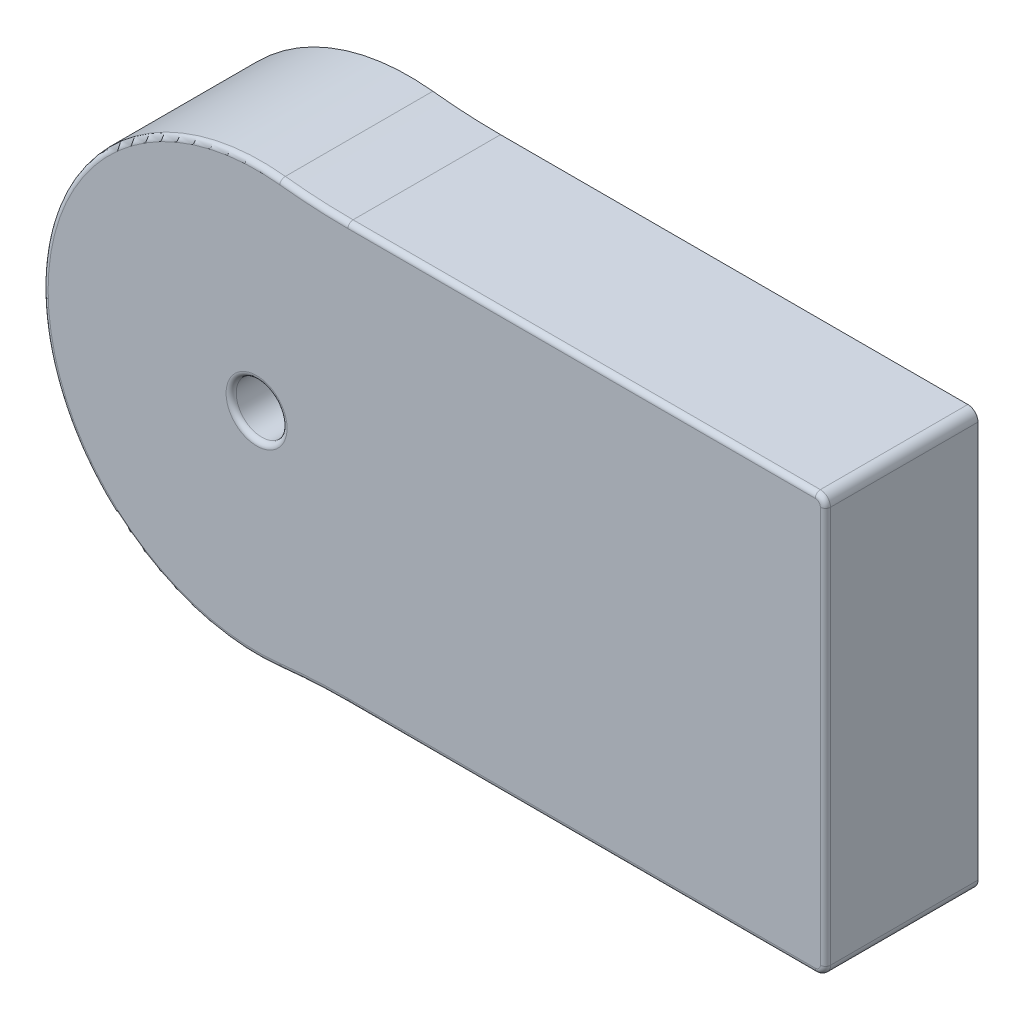
ISO-10303-21;
HEADER;
FILE_DESCRIPTION(('STEP AP214'),'2;1');
FILE_NAME('part.step','',(''),(''),'','','');
FILE_SCHEMA(('AUTOMOTIVE_DESIGN { 1 0 10303 214 1 1 1 1 }'));
ENDSEC;
DATA;
#1=APPLICATION_CONTEXT('core data for automotive mechanical design processes');
#2=APPLICATION_PROTOCOL_DEFINITION('international standard','automotive_design',2000,#1);
#3=PRODUCT_CONTEXT('',#1,'mechanical');
#4=PRODUCT('Part','Part','',(#3));
#5=PRODUCT_RELATED_PRODUCT_CATEGORY('part','',(#4));
#6=PRODUCT_DEFINITION_FORMATION('','',#4);
#7=PRODUCT_DEFINITION_CONTEXT('part definition',#1,'design');
#8=PRODUCT_DEFINITION('design','',#6,#7);
#9=PRODUCT_DEFINITION_SHAPE('','',#8);
#10=(LENGTH_UNIT() NAMED_UNIT(*) SI_UNIT(.MILLI.,.METRE.));
#11=(NAMED_UNIT(*) PLANE_ANGLE_UNIT() SI_UNIT($,.RADIAN.));
#12=(NAMED_UNIT(*) SI_UNIT($,.STERADIAN.) SOLID_ANGLE_UNIT());
#13=UNCERTAINTY_MEASURE_WITH_UNIT(LENGTH_MEASURE(1.E-05),#10,'distance_accuracy_value','');
#14=(GEOMETRIC_REPRESENTATION_CONTEXT(3) GLOBAL_UNCERTAINTY_ASSIGNED_CONTEXT((#13)) GLOBAL_UNIT_ASSIGNED_CONTEXT((#10,
#11,#12)) REPRESENTATION_CONTEXT('',''));
#15=CARTESIAN_POINT('',(0.,0.,0.));
#16=DIRECTION('',(0.,0.,1.));
#17=DIRECTION('',(1.,0.,0.));
#18=AXIS2_PLACEMENT_3D('',#15,#16,#17);
#19=CARTESIAN_POINT('',(0.,0.,30.));
#20=DIRECTION('',(0.,0.,1.));
#21=DIRECTION('',(1.,0.,0.));
#22=AXIS2_PLACEMENT_3D('',#19,#20,#21);
#23=PLANE('',#22);
#24=CARTESIAN_POINT('',(-11.8873596859431,-2.7948066727813,30.));
#25=DIRECTION('',(0.,0.,1.));
#26=DIRECTION('',(1.,0.,0.));
#27=AXIS2_PLACEMENT_3D('',#24,#25,#26);
#28=CIRCLE('',#27,6.);
#29=CARTESIAN_POINT('',(-5.88735968594307,-2.7948066727813,30.));
#30=VERTEX_POINT('',#29);
#31=EDGE_CURVE('E187',#30,#30,#28,.F.);
#32=ORIENTED_EDGE('',*,*,#31,.T.);
#33=EDGE_LOOP('',(#32));
#34=FACE_BOUND('',#33,.T.);
#35=CARTESIAN_POINT('',(97.9845980448078,-41.7948066727813,30.));
#36=DIRECTION('',(0.,0.,1.));
#37=DIRECTION('',(1.,0.,0.));
#38=AXIS2_PLACEMENT_3D('',#35,#36,#37);
#39=CIRCLE('',#38,1.);
#40=CARTESIAN_POINT('',(98.9845980448078,-41.7948066727813,30.));
#41=VERTEX_POINT('',#40);
#42=CARTESIAN_POINT('',(97.9845980448078,-42.7948066727813,30.));
#43=VERTEX_POINT('',#42);
#44=EDGE_CURVE('E229',#41,#43,#39,.F.);
#45=ORIENTED_EDGE('',*,*,#44,.F.);
#46=DIRECTION('',(0.,-1.,0.));
#47=VECTOR('',#46,1.);
#48=CARTESIAN_POINT('',(98.9845980448078,0.,30.));
#49=LINE('',#48,#47);
#50=CARTESIAN_POINT('',(98.9845980448078,36.2051933272187,30.));
#51=VERTEX_POINT('',#50);
#52=EDGE_CURVE('E197',#41,#51,#49,.F.);
#53=ORIENTED_EDGE('',*,*,#52,.T.);
#54=CARTESIAN_POINT('',(97.9845980448078,36.2051933272187,30.));
#55=DIRECTION('',(0.,0.,1.));
#56=DIRECTION('',(1.,0.,0.));
#57=AXIS2_PLACEMENT_3D('',#54,#55,#56);
#58=CIRCLE('',#57,1.);
#59=CARTESIAN_POINT('',(97.9845980448078,37.2051933272187,30.));
#60=VERTEX_POINT('',#59);
#61=EDGE_CURVE('E227',#60,#51,#58,.F.);
#62=ORIENTED_EDGE('',*,*,#61,.F.);
#63=DIRECTION('',(1.,0.,0.));
#64=VECTOR('',#63,1.);
#65=CARTESIAN_POINT('',(0.,37.2051933272187,30.));
#66=LINE('',#65,#64);
#67=CARTESIAN_POINT('',(6.08484106966808,37.2051933272187,30.));
#68=VERTEX_POINT('',#67);
#69=EDGE_CURVE('E200',#60,#68,#66,.F.);
#70=ORIENTED_EDGE('',*,*,#69,.T.);
#71=CARTESIAN_POINT('',(6.08484106966808,158.205193327219,30.));
#72=DIRECTION('',(0.,0.,1.));
#73=DIRECTION('',(1.,0.,0.));
#74=AXIS2_PLACEMENT_3D('',#71,#72,#73);
#75=CIRCLE('',#74,121.);
#76=CARTESIAN_POINT('',(-7.33883974162173,37.9521069074656,30.));
#77=VERTEX_POINT('',#76);
#78=EDGE_CURVE('E202',#68,#77,#75,.F.);
#79=ORIENTED_EDGE('',*,*,#78,.T.);
#80=CARTESIAN_POINT('',(-11.8873596859431,-2.7948066727813,30.));
#81=DIRECTION('',(0.,0.,1.));
#82=DIRECTION('',(1.,0.,0.));
#83=AXIS2_PLACEMENT_3D('',#80,#81,#82);
#84=CIRCLE('',#83,41.);
#85=CARTESIAN_POINT('',(-7.33883974162173,-43.5417202530282,30.));
#86=VERTEX_POINT('',#85);
#87=EDGE_CURVE('E195',#77,#86,#84,.T.);
#88=ORIENTED_EDGE('',*,*,#87,.T.);
#89=CARTESIAN_POINT('',(6.08484106966808,-163.794806672781,30.));
#90=DIRECTION('',(0.,0.,1.));
#91=DIRECTION('',(1.,0.,0.));
#92=AXIS2_PLACEMENT_3D('',#89,#90,#91);
#93=CIRCLE('',#92,121.);
#94=CARTESIAN_POINT('',(6.08484106966808,-42.7948066727813,30.));
#95=VERTEX_POINT('',#94);
#96=EDGE_CURVE('E190',#86,#95,#93,.F.);
#97=ORIENTED_EDGE('',*,*,#96,.T.);
#98=DIRECTION('',(1.,0.,0.));
#99=VECTOR('',#98,1.);
#100=CARTESIAN_POINT('',(99.9845980448078,-42.7948066727813,30.));
#101=LINE('',#100,#99);
#102=EDGE_CURVE('E192',#95,#43,#101,.T.);
#103=ORIENTED_EDGE('',*,*,#102,.T.);
#104=EDGE_LOOP('',(#45,#53,#62,#70,#79,#88,#97,#103));
#105=FACE_BOUND('',#104,.T.);
#106=ADVANCED_FACE('F45',(#34,#105),#23,.T.);
#107=CARTESIAN_POINT('',(-11.8873596859431,-2.7948066727813,30.));
#108=DIRECTION('',(0.,0.,-1.));
#109=DIRECTION('',(-1.,0.,0.));
#110=AXIS2_PLACEMENT_3D('',#107,#108,#109);
#111=CYLINDRICAL_SURFACE('',#110,42.);
#112=DIRECTION('',(0.,0.,-1.));
#113=VECTOR('',#112,1.);
#114=CARTESIAN_POINT('',(-7.22790023078462,-44.535547413522,30.));
#115=LINE('',#114,#113);
#116=CARTESIAN_POINT('',(-7.22790023078462,-44.535547413522,0.));
#117=VERTEX_POINT('',#116);
#118=CARTESIAN_POINT('',(-7.22790023078462,-44.535547413522,29.));
#119=VERTEX_POINT('',#118);
#120=EDGE_CURVE('E151',#117,#119,#115,.F.);
#121=ORIENTED_EDGE('',*,*,#120,.T.);
#122=CARTESIAN_POINT('',(-11.8873596859431,-2.7948066727813,29.));
#123=DIRECTION('',(0.,0.,1.));
#124=DIRECTION('',(1.,0.,0.));
#125=AXIS2_PLACEMENT_3D('',#122,#123,#124);
#126=CIRCLE('',#125,42.);
#127=CARTESIAN_POINT('',(-7.22790023078462,38.9459340679594,29.));
#128=VERTEX_POINT('',#127);
#129=EDGE_CURVE('E146',#119,#128,#126,.F.);
#130=ORIENTED_EDGE('',*,*,#129,.T.);
#131=DIRECTION('',(0.,0.,-1.));
#132=VECTOR('',#131,1.);
#133=CARTESIAN_POINT('',(-7.22790023078462,38.9459340679594,30.));
#134=LINE('',#133,#132);
#135=CARTESIAN_POINT('',(-7.22790023078462,38.9459340679594,0.));
#136=VERTEX_POINT('',#135);
#137=EDGE_CURVE('E138',#128,#136,#134,.T.);
#138=ORIENTED_EDGE('',*,*,#137,.T.);
#139=CARTESIAN_POINT('',(-11.8873596859431,-2.7948066727813,0.));
#140=DIRECTION('',(0.,0.,1.));
#141=DIRECTION('',(1.,0.,0.));
#142=AXIS2_PLACEMENT_3D('',#139,#140,#141);
#143=CIRCLE('',#142,42.);
#144=EDGE_CURVE('E143',#136,#117,#143,.T.);
#145=ORIENTED_EDGE('',*,*,#144,.T.);
#146=EDGE_LOOP('',(#121,#130,#138,#145));
#147=FACE_BOUND('',#146,.T.);
#148=ADVANCED_FACE('F141',(#147),#111,.T.);
#149=CARTESIAN_POINT('',(0.,-43.7948066727813,30.));
#150=DIRECTION('',(0.,1.,0.));
#151=DIRECTION('',(0.,0.,1.));
#152=AXIS2_PLACEMENT_3D('',#149,#150,#151);
#153=PLANE('',#152);
#154=DIRECTION('',(1.,0.,0.));
#155=VECTOR('',#154,1.);
#156=CARTESIAN_POINT('',(0.,-43.7948066727813,0.));
#157=LINE('',#156,#155);
#158=CARTESIAN_POINT('',(6.08484106966808,-43.7948066727813,0.));
#159=VERTEX_POINT('',#158);
#160=CARTESIAN_POINT('',(97.9845980448078,-43.7948066727813,0.));
#161=VERTEX_POINT('',#160);
#162=EDGE_CURVE('E165',#159,#161,#157,.T.);
#163=ORIENTED_EDGE('',*,*,#162,.T.);
#164=DIRECTION('',(0.,0.,-1.));
#165=VECTOR('',#164,1.);
#166=CARTESIAN_POINT('',(97.9845980448078,-43.7948066727813,29.));
#167=LINE('',#166,#165);
#168=CARTESIAN_POINT('',(97.9845980448078,-43.7948066727813,29.));
#169=VERTEX_POINT('',#168);
#170=EDGE_CURVE('E11',#161,#169,#167,.F.);
#171=ORIENTED_EDGE('',*,*,#170,.T.);
#172=DIRECTION('',(1.,0.,0.));
#173=VECTOR('',#172,1.);
#174=CARTESIAN_POINT('',(6.08484106966808,-43.7948066727813,29.));
#175=LINE('',#174,#173);
#176=CARTESIAN_POINT('',(6.08484106966808,-43.7948066727813,29.));
#177=VERTEX_POINT('',#176);
#178=EDGE_CURVE('E213',#169,#177,#175,.F.);
#179=ORIENTED_EDGE('',*,*,#178,.T.);
#180=DIRECTION('',(0.,0.,1.));
#181=VECTOR('',#180,1.);
#182=CARTESIAN_POINT('',(6.08484106966808,-43.7948066727813,0.));
#183=LINE('',#182,#181);
#184=EDGE_CURVE('E160',#177,#159,#183,.F.);
#185=ORIENTED_EDGE('',*,*,#184,.T.);
#186=EDGE_LOOP('',(#163,#171,#179,#185));
#187=FACE_BOUND('',#186,.T.);
#188=ADVANCED_FACE('F308',(#187),#153,.F.);
#189=CARTESIAN_POINT('',(99.9845980448078,0.,30.));
#190=DIRECTION('',(1.,0.,0.));
#191=DIRECTION('',(0.,1.,0.));
#192=AXIS2_PLACEMENT_3D('',#189,#190,#191);
#193=PLANE('',#192);
#194=DIRECTION('',(0.,-1.,0.));
#195=VECTOR('',#194,1.);
#196=CARTESIAN_POINT('',(99.9845980448078,0.,0.));
#197=LINE('',#196,#195);
#198=CARTESIAN_POINT('',(99.9845980448078,36.2051933272187,0.));
#199=VERTEX_POINT('',#198);
#200=CARTESIAN_POINT('',(99.9845980448078,-41.7948066727813,0.));
#201=VERTEX_POINT('',#200);
#202=EDGE_CURVE('E168',#199,#201,#197,.T.);
#203=ORIENTED_EDGE('',*,*,#202,.F.);
#204=DIRECTION('',(0.,0.,-1.));
#205=VECTOR('',#204,1.);
#206=CARTESIAN_POINT('',(99.9845980448078,36.2051933272187,30.));
#207=LINE('',#206,#205);
#208=CARTESIAN_POINT('',(99.9845980448078,36.2051933272187,29.));
#209=VERTEX_POINT('',#208);
#210=EDGE_CURVE('E54',#199,#209,#207,.F.);
#211=ORIENTED_EDGE('',*,*,#210,.T.);
#212=DIRECTION('',(0.,-1.,0.));
#213=VECTOR('',#212,1.);
#214=CARTESIAN_POINT('',(99.9845980448078,0.,29.));
#215=LINE('',#214,#213);
#216=CARTESIAN_POINT('',(99.9845980448078,-41.7948066727813,29.));
#217=VERTEX_POINT('',#216);
#218=EDGE_CURVE('E210',#209,#217,#215,.T.);
#219=ORIENTED_EDGE('',*,*,#218,.T.);
#220=DIRECTION('',(0.,0.,-1.));
#221=VECTOR('',#220,1.);
#222=CARTESIAN_POINT('',(99.9845980448078,-41.7948066727813,0.));
#223=LINE('',#222,#221);
#224=EDGE_CURVE('E70',#217,#201,#223,.T.);
#225=ORIENTED_EDGE('',*,*,#224,.T.);
#226=EDGE_LOOP('',(#203,#211,#219,#225));
#227=FACE_BOUND('',#226,.T.);
#228=ADVANCED_FACE('F262',(#227),#193,.T.);
#229=CARTESIAN_POINT('',(0.,38.2051933272187,30.));
#230=DIRECTION('',(0.,1.,0.));
#231=DIRECTION('',(0.,0.,1.));
#232=AXIS2_PLACEMENT_3D('',#229,#230,#231);
#233=PLANE('',#232);
#234=DIRECTION('',(1.,0.,0.));
#235=VECTOR('',#234,1.);
#236=CARTESIAN_POINT('',(0.,38.2051933272187,29.));
#237=LINE('',#236,#235);
#238=CARTESIAN_POINT('',(6.08484106966808,38.2051933272187,29.));
#239=VERTEX_POINT('',#238);
#240=CARTESIAN_POINT('',(97.9845980448078,38.2051933272187,29.));
#241=VERTEX_POINT('',#240);
#242=EDGE_CURVE('E207',#239,#241,#237,.T.);
#243=ORIENTED_EDGE('',*,*,#242,.T.);
#244=DIRECTION('',(0.,0.,-1.));
#245=VECTOR('',#244,1.);
#246=CARTESIAN_POINT('',(97.9845980448078,38.2051933272187,30.));
#247=LINE('',#246,#245);
#248=CARTESIAN_POINT('',(97.9845980448078,38.2051933272187,0.));
#249=VERTEX_POINT('',#248);
#250=EDGE_CURVE('E238',#241,#249,#247,.T.);
#251=ORIENTED_EDGE('',*,*,#250,.T.);
#252=DIRECTION('',(1.,0.,0.));
#253=VECTOR('',#252,1.);
#254=CARTESIAN_POINT('',(0.,38.2051933272187,0.));
#255=LINE('',#254,#253);
#256=CARTESIAN_POINT('',(6.08484106966808,38.2051933272187,0.));
#257=VERTEX_POINT('',#256);
#258=EDGE_CURVE('E175',#257,#249,#255,.T.);
#259=ORIENTED_EDGE('',*,*,#258,.F.);
#260=DIRECTION('',(0.,0.,-1.));
#261=VECTOR('',#260,1.);
#262=CARTESIAN_POINT('',(6.08484106966808,38.2051933272187,30.));
#263=LINE('',#262,#261);
#264=EDGE_CURVE('E150',#257,#239,#263,.F.);
#265=ORIENTED_EDGE('',*,*,#264,.T.);
#266=EDGE_LOOP('',(#243,#251,#259,#265));
#267=FACE_BOUND('',#266,.T.);
#268=ADVANCED_FACE('F260',(#267),#233,.T.);
#269=CARTESIAN_POINT('',(-11.8873596859431,-2.7948066727813,30.));
#270=DIRECTION('',(0.,0.,-1.));
#271=DIRECTION('',(-1.,0.,0.));
#272=AXIS2_PLACEMENT_3D('',#269,#270,#271);
#273=CYLINDRICAL_SURFACE('',#272,5.);
#274=CARTESIAN_POINT('',(-11.8873596859431,-2.7948066727813,29.));
#275=DIRECTION('',(0.,0.,1.));
#276=DIRECTION('',(1.,0.,0.));
#277=AXIS2_PLACEMENT_3D('',#274,#275,#276);
#278=CIRCLE('',#277,5.);
#279=CARTESIAN_POINT('',(-6.88735968594307,-2.7948066727813,29.));
#280=VERTEX_POINT('',#279);
#281=EDGE_CURVE('E184',#280,#280,#278,.T.);
#282=ORIENTED_EDGE('',*,*,#281,.T.);
#283=EDGE_LOOP('',(#282));
#284=FACE_BOUND('',#283,.T.);
#285=CARTESIAN_POINT('',(-11.8873596859431,-2.7948066727813,0.));
#286=DIRECTION('',(0.,0.,1.));
#287=DIRECTION('',(1.,0.,0.));
#288=AXIS2_PLACEMENT_3D('',#285,#286,#287);
#289=CIRCLE('',#288,5.);
#290=CARTESIAN_POINT('',(-6.88735968594307,-2.7948066727813,0.));
#291=VERTEX_POINT('',#290);
#292=EDGE_CURVE('E177',#291,#291,#289,.T.);
#293=ORIENTED_EDGE('',*,*,#292,.F.);
#294=EDGE_LOOP('',(#293));
#295=FACE_BOUND('',#294,.T.);
#296=ADVANCED_FACE('F313',(#284,#295),#273,.F.);
#297=CARTESIAN_POINT('',(0.,0.,0.));
#298=DIRECTION('',(0.,0.,1.));
#299=DIRECTION('',(1.,0.,0.));
#300=AXIS2_PLACEMENT_3D('',#297,#298,#299);
#301=PLANE('',#300);
#302=ORIENTED_EDGE('',*,*,#258,.T.);
#303=CARTESIAN_POINT('',(97.9845980448078,36.2051933272187,0.));
#304=DIRECTION('',(0.,0.,1.));
#305=DIRECTION('',(1.,0.,0.));
#306=AXIS2_PLACEMENT_3D('',#303,#304,#305);
#307=CIRCLE('',#306,2.);
#308=EDGE_CURVE('E241',#249,#199,#307,.F.);
#309=ORIENTED_EDGE('',*,*,#308,.T.);
#310=ORIENTED_EDGE('',*,*,#202,.T.);
#311=CARTESIAN_POINT('',(97.9845980448078,-41.7948066727813,0.));
#312=DIRECTION('',(0.,0.,1.));
#313=DIRECTION('',(1.,0.,0.));
#314=AXIS2_PLACEMENT_3D('',#311,#312,#313);
#315=CIRCLE('',#314,2.);
#316=EDGE_CURVE('E62',#201,#161,#315,.F.);
#317=ORIENTED_EDGE('',*,*,#316,.T.);
#318=ORIENTED_EDGE('',*,*,#162,.F.);
#319=CARTESIAN_POINT('',(6.08484106966808,-163.794806672781,0.));
#320=DIRECTION('',(0.,0.,1.));
#321=DIRECTION('',(1.,0.,0.));
#322=AXIS2_PLACEMENT_3D('',#319,#320,#321);
#323=CIRCLE('',#322,120.);
#324=EDGE_CURVE('E159',#159,#117,#323,.T.);
#325=ORIENTED_EDGE('',*,*,#324,.T.);
#326=ORIENTED_EDGE('',*,*,#144,.F.);
#327=CARTESIAN_POINT('',(6.08484106966808,158.205193327219,0.));
#328=DIRECTION('',(0.,0.,1.));
#329=DIRECTION('',(1.,0.,0.));
#330=AXIS2_PLACEMENT_3D('',#327,#328,#329);
#331=CIRCLE('',#330,120.);
#332=EDGE_CURVE('E154',#136,#257,#331,.T.);
#333=ORIENTED_EDGE('',*,*,#332,.T.);
#334=EDGE_LOOP('',(#302,#309,#310,#317,#318,#325,#326,#333));
#335=FACE_BOUND('',#334,.T.);
#336=ORIENTED_EDGE('',*,*,#292,.T.);
#337=EDGE_LOOP('',(#336));
#338=FACE_BOUND('',#337,.T.);
#339=ADVANCED_FACE('F162',(#335,#338),#301,.F.);
#340=CARTESIAN_POINT('',(6.08484106966808,158.205193327219,30.));
#341=DIRECTION('',(0.,0.,-1.));
#342=DIRECTION('',(-1.,0.,0.));
#343=AXIS2_PLACEMENT_3D('',#340,#341,#342);
#344=CYLINDRICAL_SURFACE('',#343,120.);
#345=ORIENTED_EDGE('',*,*,#137,.F.);
#346=CARTESIAN_POINT('',(6.08484106966808,158.205193327219,29.));
#347=DIRECTION('',(0.,0.,1.));
#348=DIRECTION('',(1.,0.,0.));
#349=AXIS2_PLACEMENT_3D('',#346,#347,#348);
#350=CIRCLE('',#349,120.);
#351=EDGE_CURVE('E205',#128,#239,#350,.T.);
#352=ORIENTED_EDGE('',*,*,#351,.T.);
#353=ORIENTED_EDGE('',*,*,#264,.F.);
#354=ORIENTED_EDGE('',*,*,#332,.F.);
#355=EDGE_LOOP('',(#345,#352,#353,#354));
#356=FACE_BOUND('',#355,.T.);
#357=ADVANCED_FACE('F155',(#356),#344,.F.);
#358=CARTESIAN_POINT('',(6.08484106966808,-163.794806672781,30.));
#359=DIRECTION('',(0.,0.,-1.));
#360=DIRECTION('',(-1.,0.,0.));
#361=AXIS2_PLACEMENT_3D('',#358,#359,#360);
#362=CYLINDRICAL_SURFACE('',#361,120.);
#363=ORIENTED_EDGE('',*,*,#184,.F.);
#364=CARTESIAN_POINT('',(6.08484106966808,-163.794806672781,29.));
#365=DIRECTION('',(0.,0.,1.));
#366=DIRECTION('',(1.,0.,0.));
#367=AXIS2_PLACEMENT_3D('',#364,#365,#366);
#368=CIRCLE('',#367,120.);
#369=EDGE_CURVE('E215',#177,#119,#368,.T.);
#370=ORIENTED_EDGE('',*,*,#369,.T.);
#371=ORIENTED_EDGE('',*,*,#120,.F.);
#372=ORIENTED_EDGE('',*,*,#324,.F.);
#373=EDGE_LOOP('',(#363,#370,#371,#372));
#374=FACE_BOUND('',#373,.T.);
#375=ADVANCED_FACE('F325',(#374),#362,.F.);
#376=CARTESIAN_POINT('',(-11.8873596859431,-2.7948066727813,29.));
#377=DIRECTION('',(0.,0.,1.));
#378=DIRECTION('',(1.,0.,0.));
#379=AXIS2_PLACEMENT_3D('',#376,#377,#378);
#380=TOROIDAL_SURFACE('',#379,6.,1.);
#381=ORIENTED_EDGE('',*,*,#31,.F.);
#382=EDGE_LOOP('',(#381));
#383=FACE_BOUND('',#382,.T.);
#384=ORIENTED_EDGE('',*,*,#281,.F.);
#385=EDGE_LOOP('',(#384));
#386=FACE_BOUND('',#385,.T.);
#387=ADVANCED_FACE('F328',(#383,#386),#380,.T.);
#388=CARTESIAN_POINT('',(0.,-42.7948066727813,29.));
#389=DIRECTION('',(-1.,0.,0.));
#390=DIRECTION('',(0.,0.,1.));
#391=AXIS2_PLACEMENT_3D('',#388,#389,#390);
#392=CYLINDRICAL_SURFACE('',#391,1.);
#393=ORIENTED_EDGE('',*,*,#178,.F.);
#394=CARTESIAN_POINT('',(97.9845980448078,-42.7948066727813,29.));
#395=DIRECTION('',(-1.,0.,0.));
#396=DIRECTION('',(0.,0.,1.));
#397=AXIS2_PLACEMENT_3D('',#394,#395,#396);
#398=CIRCLE('',#397,1.);
#399=EDGE_CURVE('E217',#169,#43,#398,.T.);
#400=ORIENTED_EDGE('',*,*,#399,.T.);
#401=ORIENTED_EDGE('',*,*,#102,.F.);
#402=CARTESIAN_POINT('',(6.08484106966808,-42.7948066727813,29.));
#403=DIRECTION('',(-1.,0.,0.));
#404=DIRECTION('',(0.,0.,1.));
#405=AXIS2_PLACEMENT_3D('',#402,#403,#404);
#406=CIRCLE('',#405,1.);
#407=EDGE_CURVE('E166',#177,#95,#406,.T.);
#408=ORIENTED_EDGE('',*,*,#407,.F.);
#409=EDGE_LOOP('',(#393,#400,#401,#408));
#410=FACE_BOUND('',#409,.T.);
#411=ADVANCED_FACE('F272',(#410),#392,.T.);
#412=CARTESIAN_POINT('',(98.9845980448078,0.,29.));
#413=DIRECTION('',(0.,-1.,0.));
#414=DIRECTION('',(1.,0.,0.));
#415=AXIS2_PLACEMENT_3D('',#412,#413,#414);
#416=CYLINDRICAL_SURFACE('',#415,1.);
#417=ORIENTED_EDGE('',*,*,#218,.F.);
#418=CARTESIAN_POINT('',(98.9845980448078,36.2051933272187,29.));
#419=DIRECTION('',(0.,-1.,0.));
#420=DIRECTION('',(0.,0.,-1.));
#421=AXIS2_PLACEMENT_3D('',#418,#419,#420);
#422=CIRCLE('',#421,1.);
#423=EDGE_CURVE('E233',#209,#51,#422,.T.);
#424=ORIENTED_EDGE('',*,*,#423,.T.);
#425=ORIENTED_EDGE('',*,*,#52,.F.);
#426=CARTESIAN_POINT('',(98.9845980448078,-41.7948066727813,29.));
#427=DIRECTION('',(0.,1.,0.));
#428=DIRECTION('',(0.,0.,1.));
#429=AXIS2_PLACEMENT_3D('',#426,#427,#428);
#430=CIRCLE('',#429,1.);
#431=EDGE_CURVE('E231',#41,#217,#430,.T.);
#432=ORIENTED_EDGE('',*,*,#431,.T.);
#433=EDGE_LOOP('',(#417,#424,#425,#432));
#434=FACE_BOUND('',#433,.T.);
#435=ADVANCED_FACE('F265',(#434),#416,.T.);
#436=CARTESIAN_POINT('',(6.08484106966808,-163.794806672781,29.));
#437=DIRECTION('',(0.,0.,1.));
#438=DIRECTION('',(1.,0.,0.));
#439=AXIS2_PLACEMENT_3D('',#436,#437,#438);
#440=TOROIDAL_SURFACE('',#439,121.,1.);
#441=ORIENTED_EDGE('',*,*,#407,.T.);
#442=ORIENTED_EDGE('',*,*,#96,.F.);
#443=CARTESIAN_POINT('',(-7.33883974162173,-43.5417202530282,29.));
#444=DIRECTION('',(-0.993827160493827,-0.110939510837106,0.));
#445=DIRECTION('',(0.110939510837106,-0.993827160493827,0.));
#446=AXIS2_PLACEMENT_3D('',#443,#444,#445);
#447=CIRCLE('',#446,1.);
#448=EDGE_CURVE('E171',#119,#86,#447,.T.);
#449=ORIENTED_EDGE('',*,*,#448,.F.);
#450=ORIENTED_EDGE('',*,*,#369,.F.);
#451=EDGE_LOOP('',(#441,#442,#449,#450));
#452=FACE_BOUND('',#451,.T.);
#453=ADVANCED_FACE('F278',(#452),#440,.T.);
#454=CARTESIAN_POINT('',(0.,37.2051933272187,29.));
#455=DIRECTION('',(1.,0.,0.));
#456=DIRECTION('',(0.,0.,-1.));
#457=AXIS2_PLACEMENT_3D('',#454,#455,#456);
#458=CYLINDRICAL_SURFACE('',#457,1.);
#459=ORIENTED_EDGE('',*,*,#69,.F.);
#460=CARTESIAN_POINT('',(97.9845980448078,37.2051933272187,29.));
#461=DIRECTION('',(-1.,0.,0.));
#462=DIRECTION('',(0.,0.,1.));
#463=AXIS2_PLACEMENT_3D('',#460,#461,#462);
#464=CIRCLE('',#463,1.);
#465=EDGE_CURVE('E236',#60,#241,#464,.T.);
#466=ORIENTED_EDGE('',*,*,#465,.T.);
#467=ORIENTED_EDGE('',*,*,#242,.F.);
#468=CARTESIAN_POINT('',(6.08484106966808,37.2051933272187,29.));
#469=DIRECTION('',(-1.,0.,0.));
#470=DIRECTION('',(0.,0.,1.));
#471=AXIS2_PLACEMENT_3D('',#468,#469,#470);
#472=CIRCLE('',#471,1.);
#473=EDGE_CURVE('E220',#68,#239,#472,.T.);
#474=ORIENTED_EDGE('',*,*,#473,.F.);
#475=EDGE_LOOP('',(#459,#466,#467,#474));
#476=FACE_BOUND('',#475,.T.);
#477=ADVANCED_FACE('F289',(#476),#458,.T.);
#478=CARTESIAN_POINT('',(-11.8873596859431,-2.7948066727813,29.));
#479=DIRECTION('',(0.,0.,1.));
#480=DIRECTION('',(1.,0.,0.));
#481=AXIS2_PLACEMENT_3D('',#478,#479,#480);
#482=TOROIDAL_SURFACE('',#481,41.,1.);
#483=ORIENTED_EDGE('',*,*,#448,.T.);
#484=ORIENTED_EDGE('',*,*,#87,.F.);
#485=CARTESIAN_POINT('',(-7.33883974162173,37.9521069074656,29.));
#486=DIRECTION('',(0.993827160493827,-0.110939510837106,0.));
#487=DIRECTION('',(0.110939510837106,0.993827160493827,0.));
#488=AXIS2_PLACEMENT_3D('',#485,#486,#487);
#489=CIRCLE('',#488,1.);
#490=EDGE_CURVE('E218',#128,#77,#489,.T.);
#491=ORIENTED_EDGE('',*,*,#490,.F.);
#492=ORIENTED_EDGE('',*,*,#129,.F.);
#493=EDGE_LOOP('',(#483,#484,#491,#492));
#494=FACE_BOUND('',#493,.T.);
#495=ADVANCED_FACE('F281',(#494),#482,.T.);
#496=CARTESIAN_POINT('',(6.08484106966808,158.205193327219,29.));
#497=DIRECTION('',(0.,0.,1.));
#498=DIRECTION('',(1.,0.,0.));
#499=AXIS2_PLACEMENT_3D('',#496,#497,#498);
#500=TOROIDAL_SURFACE('',#499,121.,1.);
#501=ORIENTED_EDGE('',*,*,#473,.T.);
#502=ORIENTED_EDGE('',*,*,#351,.F.);
#503=ORIENTED_EDGE('',*,*,#490,.T.);
#504=ORIENTED_EDGE('',*,*,#78,.F.);
#505=EDGE_LOOP('',(#501,#502,#503,#504));
#506=FACE_BOUND('',#505,.T.);
#507=ADVANCED_FACE('F285',(#506),#500,.T.);
#508=CARTESIAN_POINT('',(97.9845980448078,-41.7948066727813,30.));
#509=DIRECTION('',(0.,0.,1.));
#510=DIRECTION('',(1.,0.,0.));
#511=AXIS2_PLACEMENT_3D('',#508,#509,#510);
#512=CYLINDRICAL_SURFACE('',#511,2.);
#513=ORIENTED_EDGE('',*,*,#316,.F.);
#514=ORIENTED_EDGE('',*,*,#224,.F.);
#515=CARTESIAN_POINT('',(97.9845980448078,-41.7948066727813,29.));
#516=DIRECTION('',(0.,0.,1.));
#517=DIRECTION('',(1.,0.,0.));
#518=AXIS2_PLACEMENT_3D('',#515,#516,#517);
#519=CIRCLE('',#518,2.);
#520=EDGE_CURVE('E221',#169,#217,#519,.T.);
#521=ORIENTED_EDGE('',*,*,#520,.F.);
#522=ORIENTED_EDGE('',*,*,#170,.F.);
#523=EDGE_LOOP('',(#513,#514,#521,#522));
#524=FACE_BOUND('',#523,.T.);
#525=ADVANCED_FACE('F333',(#524),#512,.T.);
#526=CARTESIAN_POINT('',(97.9845980448078,-41.7948066727813,29.));
#527=DIRECTION('',(0.,0.,1.));
#528=DIRECTION('',(1.,0.,0.));
#529=AXIS2_PLACEMENT_3D('',#526,#527,#528);
#530=DEGENERATE_TOROIDAL_SURFACE('',#529,1.,1.,.T.);
#531=ORIENTED_EDGE('',*,*,#399,.F.);
#532=ORIENTED_EDGE('',*,*,#520,.T.);
#533=ORIENTED_EDGE('',*,*,#431,.F.);
#534=ORIENTED_EDGE('',*,*,#44,.T.);
#535=EDGE_LOOP('',(#531,#532,#533,#534));
#536=FACE_BOUND('',#535,.T.);
#537=ADVANCED_FACE('F267',(#536),#530,.T.);
#538=CARTESIAN_POINT('',(97.9845980448078,36.2051933272187,30.));
#539=DIRECTION('',(0.,0.,-1.));
#540=DIRECTION('',(-1.,0.,0.));
#541=AXIS2_PLACEMENT_3D('',#538,#539,#540);
#542=CYLINDRICAL_SURFACE('',#541,2.);
#543=ORIENTED_EDGE('',*,*,#308,.F.);
#544=ORIENTED_EDGE('',*,*,#250,.F.);
#545=CARTESIAN_POINT('',(97.9845980448078,36.2051933272187,29.));
#546=DIRECTION('',(0.,0.,1.));
#547=DIRECTION('',(1.,0.,0.));
#548=AXIS2_PLACEMENT_3D('',#545,#546,#547);
#549=CIRCLE('',#548,2.);
#550=EDGE_CURVE('E49',#209,#241,#549,.T.);
#551=ORIENTED_EDGE('',*,*,#550,.F.);
#552=ORIENTED_EDGE('',*,*,#210,.F.);
#553=EDGE_LOOP('',(#543,#544,#551,#552));
#554=FACE_BOUND('',#553,.T.);
#555=ADVANCED_FACE('F47',(#554),#542,.T.);
#556=CARTESIAN_POINT('',(97.9845980448078,36.2051933272187,29.));
#557=DIRECTION('',(0.,0.,1.));
#558=DIRECTION('',(1.,0.,0.));
#559=AXIS2_PLACEMENT_3D('',#556,#557,#558);
#560=DEGENERATE_TOROIDAL_SURFACE('',#559,1.,1.,.T.);
#561=ORIENTED_EDGE('',*,*,#423,.F.);
#562=ORIENTED_EDGE('',*,*,#550,.T.);
#563=ORIENTED_EDGE('',*,*,#465,.F.);
#564=ORIENTED_EDGE('',*,*,#61,.T.);
#565=EDGE_LOOP('',(#561,#562,#563,#564));
#566=FACE_BOUND('',#565,.T.);
#567=ADVANCED_FACE('F254',(#566),#560,.T.);
#568=CLOSED_SHELL('',(#106,#148,#188,#228,#268,#296,#339,#357,#375,#387,#411,#435,#453,#477,
#495,#507,#525,#537,#555,#567));
#569=MANIFOLD_SOLID_BREP('B2',#568);
#570=ADVANCED_BREP_SHAPE_REPRESENTATION('',(#18,#569),#14);
#571=SHAPE_DEFINITION_REPRESENTATION(#9,#570);
ENDSEC;
END-ISO-10303-21;
